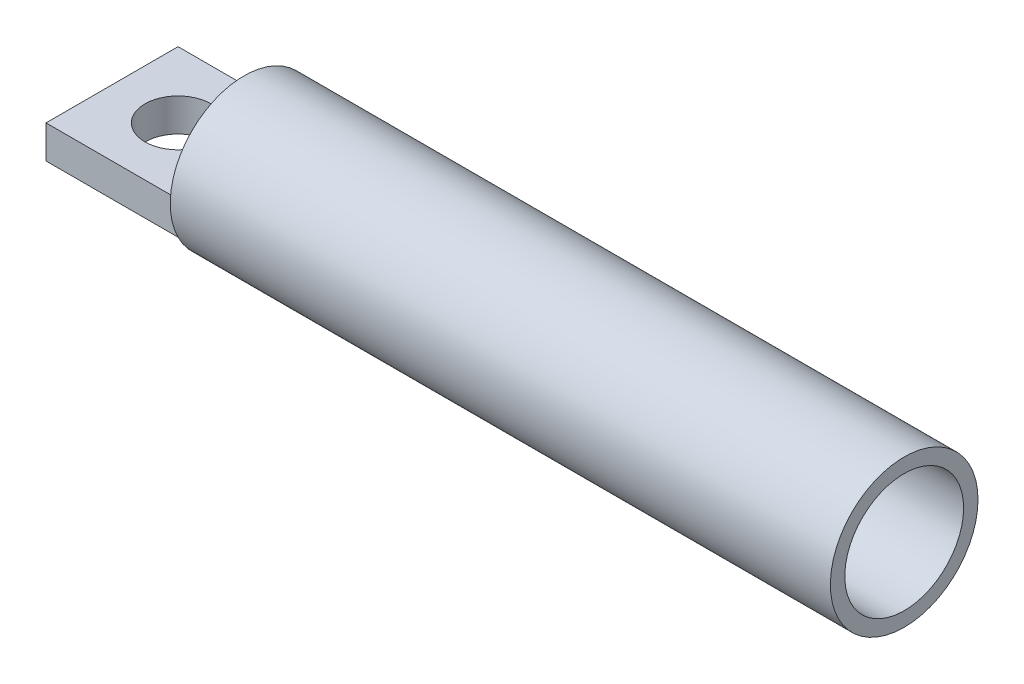
ISO-10303-21;
HEADER;
FILE_DESCRIPTION(('STEP AP214'),'2;1');
FILE_NAME('part.step','',(''),(''),'','','');
FILE_SCHEMA(('AUTOMOTIVE_DESIGN { 1 0 10303 214 1 1 1 1 }'));
ENDSEC;
DATA;
#1=APPLICATION_CONTEXT('core data for automotive mechanical design processes');
#2=APPLICATION_PROTOCOL_DEFINITION('international standard','automotive_design',2000,#1);
#3=PRODUCT_CONTEXT('',#1,'mechanical');
#4=PRODUCT('Part','Part','',(#3));
#5=PRODUCT_RELATED_PRODUCT_CATEGORY('part','',(#4));
#6=PRODUCT_DEFINITION_FORMATION('','',#4);
#7=PRODUCT_DEFINITION_CONTEXT('part definition',#1,'design');
#8=PRODUCT_DEFINITION('design','',#6,#7);
#9=PRODUCT_DEFINITION_SHAPE('','',#8);
#10=(LENGTH_UNIT() NAMED_UNIT(*) SI_UNIT(.MILLI.,.METRE.));
#11=(NAMED_UNIT(*) PLANE_ANGLE_UNIT() SI_UNIT($,.RADIAN.));
#12=(NAMED_UNIT(*) SI_UNIT($,.STERADIAN.) SOLID_ANGLE_UNIT());
#13=UNCERTAINTY_MEASURE_WITH_UNIT(LENGTH_MEASURE(1.E-05),#10,'distance_accuracy_value','');
#14=(GEOMETRIC_REPRESENTATION_CONTEXT(3) GLOBAL_UNCERTAINTY_ASSIGNED_CONTEXT((#13)) GLOBAL_UNIT_ASSIGNED_CONTEXT((#10,
#11,#12)) REPRESENTATION_CONTEXT('',''));
#15=CARTESIAN_POINT('',(0.,0.,0.));
#16=DIRECTION('',(0.,0.,1.));
#17=DIRECTION('',(1.,0.,0.));
#18=AXIS2_PLACEMENT_3D('',#15,#16,#17);
#19=CARTESIAN_POINT('',(-60.325226112274,13.3614489119886,25.4));
#20=DIRECTION('',(-1.,0.,0.));
#21=DIRECTION('',(0.,0.,1.));
#22=AXIS2_PLACEMENT_3D('',#19,#20,#21);
#23=PLANE('',#22);
#24=DIRECTION('',(0.,0.,-1.));
#25=VECTOR('',#24,1.);
#26=CARTESIAN_POINT('',(-60.325226112274,13.3614489119886,25.4));
#27=LINE('',#26,#25);
#28=CARTESIAN_POINT('',(-60.325226112274,13.3614489119886,20.32));
#29=VERTEX_POINT('',#28);
#30=CARTESIAN_POINT('',(-60.325226112274,13.3614489119886,-71.12));
#31=VERTEX_POINT('',#30);
#32=EDGE_CURVE('E155',#29,#31,#27,.T.);
#33=ORIENTED_EDGE('',*,*,#32,.F.);
#34=CARTESIAN_POINT('',(-60.325226112274,13.3614489119886,-25.4));
#35=DIRECTION('',(1.,0.,0.));
#36=DIRECTION('',(0.,0.,-1.));
#37=AXIS2_PLACEMENT_3D('',#34,#35,#36);
#38=CIRCLE('',#37,45.72);
#39=CARTESIAN_POINT('',(-60.325226112274,-12.0385510880114,12.6152390496232));
#40=VERTEX_POINT('',#39);
#41=EDGE_CURVE('E11',#29,#40,#38,.T.);
#42=ORIENTED_EDGE('',*,*,#41,.T.);
#43=DIRECTION('',(0.,0.,-1.));
#44=VECTOR('',#43,1.);
#45=CARTESIAN_POINT('',(-60.325226112274,-12.0385510880114,25.4));
#46=LINE('',#45,#44);
#47=CARTESIAN_POINT('',(-60.325226112274,-12.0385510880114,-63.4152390496232));
#48=VERTEX_POINT('',#47);
#49=EDGE_CURVE('E130',#40,#48,#46,.T.);
#50=ORIENTED_EDGE('',*,*,#49,.T.);
#51=EDGE_CURVE('E47',#48,#31,#38,.T.);
#52=ORIENTED_EDGE('',*,*,#51,.T.);
#53=EDGE_LOOP('',(#33,#42,#50,#52));
#54=FACE_BOUND('',#53,.T.);
#55=ADVANCED_FACE('F38',(#54),#23,.F.);
#56=CARTESIAN_POINT('',(-161.925226112274,13.3614489119886,25.4));
#57=DIRECTION('',(0.,-1.,0.));
#58=DIRECTION('',(0.,0.,-1.));
#59=AXIS2_PLACEMENT_3D('',#56,#57,#58);
#60=PLANE('',#59);
#61=DIRECTION('',(0.,0.,1.));
#62=VECTOR('',#61,1.);
#63=CARTESIAN_POINT('',(-161.925226112274,13.3614489119886,25.4));
#64=LINE('',#63,#62);
#65=CARTESIAN_POINT('',(-161.925226112274,13.3614489119886,-76.2));
#66=VERTEX_POINT('',#65);
#67=CARTESIAN_POINT('',(-161.925226112274,13.3614489119886,25.4));
#68=VERTEX_POINT('',#67);
#69=EDGE_CURVE('E133',#66,#68,#64,.T.);
#70=ORIENTED_EDGE('',*,*,#69,.T.);
#71=DIRECTION('',(1.,0.,0.));
#72=VECTOR('',#71,1.);
#73=CARTESIAN_POINT('',(-161.925226112274,13.3614489119886,25.4));
#74=LINE('',#73,#72);
#75=CARTESIAN_POINT('',(-60.325226112274,13.3614489119886,25.4));
#76=VERTEX_POINT('',#75);
#77=EDGE_CURVE('E157',#68,#76,#74,.T.);
#78=ORIENTED_EDGE('',*,*,#77,.T.);
#79=EDGE_CURVE('E98',#76,#29,#27,.T.);
#80=ORIENTED_EDGE('',*,*,#79,.T.);
#81=ORIENTED_EDGE('',*,*,#32,.T.);
#82=CARTESIAN_POINT('',(-60.325226112274,13.3614489119886,-76.2));
#83=VERTEX_POINT('',#82);
#84=EDGE_CURVE('E156',#31,#83,#27,.T.);
#85=ORIENTED_EDGE('',*,*,#84,.T.);
#86=DIRECTION('',(-1.,0.,0.));
#87=VECTOR('',#86,1.);
#88=CARTESIAN_POINT('',(-161.925226112274,13.3614489119886,-76.2));
#89=LINE('',#88,#87);
#90=EDGE_CURVE('E140',#83,#66,#89,.T.);
#91=ORIENTED_EDGE('',*,*,#90,.T.);
#92=EDGE_LOOP('',(#70,#78,#80,#81,#85,#91));
#93=FACE_BOUND('',#92,.T.);
#94=CARTESIAN_POINT('',(-111.125226112274,13.3614489119886,-25.4));
#95=DIRECTION('',(0.,1.,0.));
#96=DIRECTION('',(0.,0.,1.));
#97=AXIS2_PLACEMENT_3D('',#94,#95,#96);
#98=CIRCLE('',#97,25.4);
#99=CARTESIAN_POINT('',(-111.125226112274,13.3614489119886,0.));
#100=VERTEX_POINT('',#99);
#101=EDGE_CURVE('E148',#100,#100,#98,.T.);
#102=ORIENTED_EDGE('',*,*,#101,.F.);
#103=EDGE_LOOP('',(#102));
#104=FACE_BOUND('',#103,.T.);
#105=ADVANCED_FACE('F183',(#93,#104),#60,.F.);
#106=CARTESIAN_POINT('',(-161.925226112274,-12.0385510880114,25.4));
#107=DIRECTION('',(0.,-1.,0.));
#108=DIRECTION('',(0.,0.,-1.));
#109=AXIS2_PLACEMENT_3D('',#106,#107,#108);
#110=PLANE('',#109);
#111=DIRECTION('',(0.,0.,1.));
#112=VECTOR('',#111,1.);
#113=CARTESIAN_POINT('',(-161.925226112274,-12.0385510880114,25.4));
#114=LINE('',#113,#112);
#115=CARTESIAN_POINT('',(-161.925226112274,-12.0385510880114,-76.2));
#116=VERTEX_POINT('',#115);
#117=CARTESIAN_POINT('',(-161.925226112274,-12.0385510880114,25.4));
#118=VERTEX_POINT('',#117);
#119=EDGE_CURVE('E124',#116,#118,#114,.T.);
#120=ORIENTED_EDGE('',*,*,#119,.F.);
#121=DIRECTION('',(-1.,0.,0.));
#122=VECTOR('',#121,1.);
#123=CARTESIAN_POINT('',(-161.925226112274,-12.0385510880114,-76.2));
#124=LINE('',#123,#122);
#125=CARTESIAN_POINT('',(-60.325226112274,-12.0385510880114,-76.2));
#126=VERTEX_POINT('',#125);
#127=EDGE_CURVE('E131',#126,#116,#124,.T.);
#128=ORIENTED_EDGE('',*,*,#127,.F.);
#129=EDGE_CURVE('E115',#48,#126,#46,.T.);
#130=ORIENTED_EDGE('',*,*,#129,.F.);
#131=ORIENTED_EDGE('',*,*,#49,.F.);
#132=CARTESIAN_POINT('',(-60.325226112274,-12.0385510880114,25.4));
#133=VERTEX_POINT('',#132);
#134=EDGE_CURVE('E113',#133,#40,#46,.T.);
#135=ORIENTED_EDGE('',*,*,#134,.F.);
#136=DIRECTION('',(1.,0.,0.));
#137=VECTOR('',#136,1.);
#138=CARTESIAN_POINT('',(-161.925226112274,-12.0385510880114,25.4));
#139=LINE('',#138,#137);
#140=EDGE_CURVE('E118',#118,#133,#139,.T.);
#141=ORIENTED_EDGE('',*,*,#140,.F.);
#142=EDGE_LOOP('',(#120,#128,#130,#131,#135,#141));
#143=FACE_BOUND('',#142,.T.);
#144=CARTESIAN_POINT('',(-111.125226112274,-12.0385510880114,-25.4));
#145=DIRECTION('',(0.,1.,0.));
#146=DIRECTION('',(0.,0.,1.));
#147=AXIS2_PLACEMENT_3D('',#144,#145,#146);
#148=CIRCLE('',#147,25.4);
#149=CARTESIAN_POINT('',(-111.125226112274,-12.0385510880114,0.));
#150=VERTEX_POINT('',#149);
#151=EDGE_CURVE('E150',#150,#150,#148,.T.);
#152=ORIENTED_EDGE('',*,*,#151,.T.);
#153=EDGE_LOOP('',(#152));
#154=FACE_BOUND('',#153,.T.);
#155=ADVANCED_FACE('F127',(#143,#154),#110,.T.);
#156=CARTESIAN_POINT('',(-161.925226112274,13.3614489119886,25.4));
#157=DIRECTION('',(1.,0.,0.));
#158=DIRECTION('',(0.,0.,-1.));
#159=AXIS2_PLACEMENT_3D('',#156,#157,#158);
#160=PLANE('',#159);
#161=ORIENTED_EDGE('',*,*,#119,.T.);
#162=DIRECTION('',(0.,-1.,0.));
#163=VECTOR('',#162,1.);
#164=CARTESIAN_POINT('',(-161.925226112274,13.3614489119886,25.4));
#165=LINE('',#164,#163);
#166=EDGE_CURVE('E42',#68,#118,#165,.T.);
#167=ORIENTED_EDGE('',*,*,#166,.F.);
#168=ORIENTED_EDGE('',*,*,#69,.F.);
#169=DIRECTION('',(0.,-1.,0.));
#170=VECTOR('',#169,1.);
#171=CARTESIAN_POINT('',(-161.925226112274,13.3614489119886,-76.2));
#172=LINE('',#171,#170);
#173=EDGE_CURVE('E137',#66,#116,#172,.T.);
#174=ORIENTED_EDGE('',*,*,#173,.T.);
#175=EDGE_LOOP('',(#161,#167,#168,#174));
#176=FACE_BOUND('',#175,.T.);
#177=ADVANCED_FACE('F40',(#176),#160,.F.);
#178=CARTESIAN_POINT('',(-161.925226112274,13.3614489119886,25.4));
#179=DIRECTION('',(0.,0.,-1.));
#180=DIRECTION('',(-1.,0.,0.));
#181=AXIS2_PLACEMENT_3D('',#178,#179,#180);
#182=PLANE('',#181);
#183=ORIENTED_EDGE('',*,*,#140,.T.);
#184=DIRECTION('',(0.,-1.,0.));
#185=VECTOR('',#184,1.);
#186=CARTESIAN_POINT('',(-60.325226112274,13.3614489119886,25.4));
#187=LINE('',#186,#185);
#188=EDGE_CURVE('E92',#76,#133,#187,.T.);
#189=ORIENTED_EDGE('',*,*,#188,.F.);
#190=ORIENTED_EDGE('',*,*,#77,.F.);
#191=ORIENTED_EDGE('',*,*,#166,.T.);
#192=EDGE_LOOP('',(#183,#189,#190,#191));
#193=FACE_BOUND('',#192,.T.);
#194=ADVANCED_FACE('F119',(#193),#182,.F.);
#195=CARTESIAN_POINT('',(-161.925226112274,13.3614489119886,-76.2));
#196=DIRECTION('',(0.,0.,1.));
#197=DIRECTION('',(1.,0.,0.));
#198=AXIS2_PLACEMENT_3D('',#195,#196,#197);
#199=PLANE('',#198);
#200=ORIENTED_EDGE('',*,*,#127,.T.);
#201=ORIENTED_EDGE('',*,*,#173,.F.);
#202=ORIENTED_EDGE('',*,*,#90,.F.);
#203=DIRECTION('',(0.,-1.,0.));
#204=VECTOR('',#203,1.);
#205=CARTESIAN_POINT('',(-60.325226112274,13.3614489119886,-76.2));
#206=LINE('',#205,#204);
#207=EDGE_CURVE('E102',#83,#126,#206,.T.);
#208=ORIENTED_EDGE('',*,*,#207,.T.);
#209=EDGE_LOOP('',(#200,#201,#202,#208));
#210=FACE_BOUND('',#209,.T.);
#211=ADVANCED_FACE('F144',(#210),#199,.F.);
#212=CARTESIAN_POINT('',(-111.125226112274,13.3614489119886,-25.4));
#213=DIRECTION('',(0.,-1.,0.));
#214=DIRECTION('',(0.,0.,-1.));
#215=AXIS2_PLACEMENT_3D('',#212,#213,#214);
#216=CYLINDRICAL_SURFACE('',#215,25.4);
#217=ORIENTED_EDGE('',*,*,#101,.T.);
#218=EDGE_LOOP('',(#217));
#219=FACE_BOUND('',#218,.T.);
#220=ORIENTED_EDGE('',*,*,#151,.F.);
#221=EDGE_LOOP('',(#220));
#222=FACE_BOUND('',#221,.T.);
#223=ADVANCED_FACE('F199',(#219,#222),#216,.F.);
#224=CARTESIAN_POINT('',(-60.325226112274,13.3614489119886,-25.4));
#225=DIRECTION('',(1.,0.,0.));
#226=DIRECTION('',(0.,0.,-1.));
#227=AXIS2_PLACEMENT_3D('',#224,#225,#226);
#228=PLANE('',#227);
#229=EDGE_CURVE('E49',#40,#48,#38,.T.);
#230=ORIENTED_EDGE('',*,*,#229,.T.);
#231=ORIENTED_EDGE('',*,*,#129,.T.);
#232=CARTESIAN_POINT('',(-60.325226112274,13.3614489119886,-25.4));
#233=DIRECTION('',(1.,0.,0.));
#234=DIRECTION('',(0.,0.,-1.));
#235=AXIS2_PLACEMENT_3D('',#232,#233,#234);
#236=CIRCLE('',#235,56.7961266284947);
#237=EDGE_CURVE('E106',#133,#126,#236,.T.);
#238=ORIENTED_EDGE('',*,*,#237,.F.);
#239=ORIENTED_EDGE('',*,*,#134,.T.);
#240=EDGE_LOOP('',(#230,#231,#238,#239));
#241=FACE_BOUND('',#240,.T.);
#242=ADVANCED_FACE('F111',(#241),#228,.F.);
#243=ORIENTED_EDGE('',*,*,#207,.F.);
#244=ORIENTED_EDGE('',*,*,#84,.F.);
#245=EDGE_CURVE('E56',#31,#29,#38,.T.);
#246=ORIENTED_EDGE('',*,*,#245,.T.);
#247=ORIENTED_EDGE('',*,*,#79,.F.);
#248=ORIENTED_EDGE('',*,*,#188,.T.);
#249=EDGE_CURVE('E95',#126,#133,#236,.T.);
#250=ORIENTED_EDGE('',*,*,#249,.F.);
#251=EDGE_LOOP('',(#243,#244,#246,#247,#248,#250));
#252=FACE_BOUND('',#251,.T.);
#253=ADVANCED_FACE('F94',(#252),#228,.F.);
#254=CARTESIAN_POINT('',(447.674773887726,13.3614489119886,-25.4));
#255=DIRECTION('',(1.,0.,0.));
#256=DIRECTION('',(0.,0.,-1.));
#257=AXIS2_PLACEMENT_3D('',#254,#255,#256);
#258=PLANE('',#257);
#259=CARTESIAN_POINT('',(447.674773887726,13.3614489119886,-25.4));
#260=DIRECTION('',(1.,0.,0.));
#261=DIRECTION('',(0.,0.,-1.));
#262=AXIS2_PLACEMENT_3D('',#259,#260,#261);
#263=CIRCLE('',#262,56.7961266284947);
#264=CARTESIAN_POINT('',(447.674773887726,13.3614489119886,-82.1961266284947));
#265=VERTEX_POINT('',#264);
#266=EDGE_CURVE('E116',#265,#265,#263,.T.);
#267=ORIENTED_EDGE('',*,*,#266,.T.);
#268=EDGE_LOOP('',(#267));
#269=FACE_BOUND('',#268,.T.);
#270=CARTESIAN_POINT('',(447.674773887726,13.3614489119886,-25.4));
#271=DIRECTION('',(1.,0.,0.));
#272=DIRECTION('',(0.,0.,-1.));
#273=AXIS2_PLACEMENT_3D('',#270,#271,#272);
#274=CIRCLE('',#273,45.72);
#275=CARTESIAN_POINT('',(447.674773887726,13.3614489119886,-71.12));
#276=VERTEX_POINT('',#275);
#277=EDGE_CURVE('E108',#276,#276,#274,.T.);
#278=ORIENTED_EDGE('',*,*,#277,.F.);
#279=EDGE_LOOP('',(#278));
#280=FACE_BOUND('',#279,.T.);
#281=ADVANCED_FACE('F170',(#269,#280),#258,.T.);
#282=CARTESIAN_POINT('',(447.674773887726,13.3614489119886,-25.4));
#283=DIRECTION('',(-1.,0.,0.));
#284=DIRECTION('',(0.,0.,1.));
#285=AXIS2_PLACEMENT_3D('',#282,#283,#284);
#286=CYLINDRICAL_SURFACE('',#285,56.7961266284947);
#287=ORIENTED_EDGE('',*,*,#266,.F.);
#288=EDGE_LOOP('',(#287));
#289=FACE_BOUND('',#288,.T.);
#290=ORIENTED_EDGE('',*,*,#237,.T.);
#291=ORIENTED_EDGE('',*,*,#249,.T.);
#292=EDGE_LOOP('',(#290,#291));
#293=FACE_BOUND('',#292,.T.);
#294=ADVANCED_FACE('F105',(#289,#293),#286,.T.);
#295=CARTESIAN_POINT('',(447.674773887726,13.3614489119886,-25.4));
#296=DIRECTION('',(-1.,0.,0.));
#297=DIRECTION('',(0.,0.,1.));
#298=AXIS2_PLACEMENT_3D('',#295,#296,#297);
#299=CYLINDRICAL_SURFACE('',#298,45.72);
#300=ORIENTED_EDGE('',*,*,#277,.T.);
#301=EDGE_LOOP('',(#300));
#302=FACE_BOUND('',#301,.T.);
#303=ORIENTED_EDGE('',*,*,#245,.F.);
#304=ORIENTED_EDGE('',*,*,#51,.F.);
#305=ORIENTED_EDGE('',*,*,#229,.F.);
#306=ORIENTED_EDGE('',*,*,#41,.F.);
#307=EDGE_LOOP('',(#303,#304,#305,#306));
#308=FACE_BOUND('',#307,.T.);
#309=ADVANCED_FACE('F168',(#302,#308),#299,.F.);
#310=CLOSED_SHELL('',(#55,#105,#155,#177,#194,#211,#223,#242,#253,#281,#294,#309));
#311=MANIFOLD_SOLID_BREP('B2',#310);
#312=ADVANCED_BREP_SHAPE_REPRESENTATION('',(#18,#311),#14);
#313=SHAPE_DEFINITION_REPRESENTATION(#9,#312);
ENDSEC;
END-ISO-10303-21;
